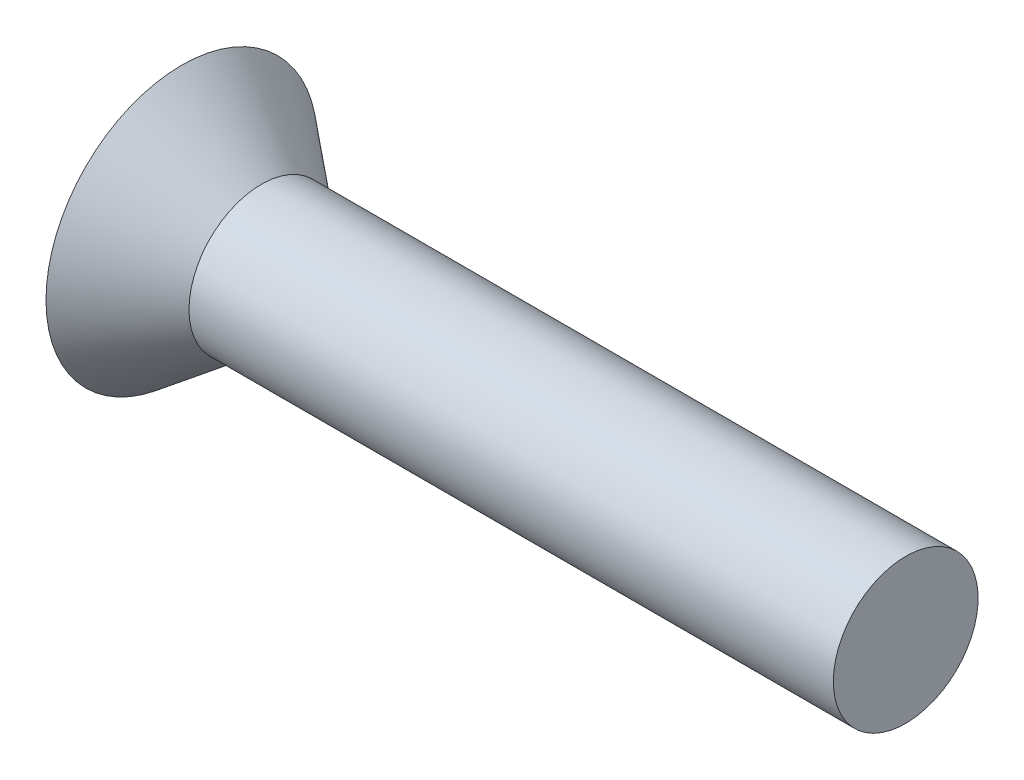
ISO-10303-21;
HEADER;
FILE_DESCRIPTION(('STEP AP214'),'2;1');
FILE_NAME('part.step','',(''),(''),'','','');
FILE_SCHEMA(('AUTOMOTIVE_DESIGN { 1 0 10303 214 1 1 1 1 }'));
ENDSEC;
DATA;
#1=APPLICATION_CONTEXT('core data for automotive mechanical design processes');
#2=APPLICATION_PROTOCOL_DEFINITION('international standard','automotive_design',2000,#1);
#3=PRODUCT_CONTEXT('',#1,'mechanical');
#4=PRODUCT('Part','Part','',(#3));
#5=PRODUCT_RELATED_PRODUCT_CATEGORY('part','',(#4));
#6=PRODUCT_DEFINITION_FORMATION('','',#4);
#7=PRODUCT_DEFINITION_CONTEXT('part definition',#1,'design');
#8=PRODUCT_DEFINITION('design','',#6,#7);
#9=PRODUCT_DEFINITION_SHAPE('','',#8);
#10=(LENGTH_UNIT() NAMED_UNIT(*) SI_UNIT(.MILLI.,.METRE.));
#11=(NAMED_UNIT(*) PLANE_ANGLE_UNIT() SI_UNIT($,.RADIAN.));
#12=(NAMED_UNIT(*) SI_UNIT($,.STERADIAN.) SOLID_ANGLE_UNIT());
#13=UNCERTAINTY_MEASURE_WITH_UNIT(LENGTH_MEASURE(1.E-05),#10,'distance_accuracy_value','');
#14=(GEOMETRIC_REPRESENTATION_CONTEXT(3) GLOBAL_UNCERTAINTY_ASSIGNED_CONTEXT((#13)) GLOBAL_UNIT_ASSIGNED_CONTEXT((#10,
#11,#12)) REPRESENTATION_CONTEXT('',''));
#15=CARTESIAN_POINT('',(0.,0.,0.));
#16=DIRECTION('',(0.,0.,1.));
#17=DIRECTION('',(1.,0.,0.));
#18=AXIS2_PLACEMENT_3D('',#15,#16,#17);
#19=CARTESIAN_POINT('',(0.,0.,0.));
#20=DIRECTION('',(1.,0.,0.));
#21=DIRECTION('',(0.,0.,-1.));
#22=AXIS2_PLACEMENT_3D('',#19,#20,#21);
#23=PLANE('',#22);
#24=CARTESIAN_POINT('',(0.,0.,0.));
#25=DIRECTION('',(-1.,0.,0.));
#26=DIRECTION('',(0.,0.,1.));
#27=AXIS2_PLACEMENT_3D('',#24,#25,#26);
#28=CIRCLE('',#27,3.75);
#29=CARTESIAN_POINT('',(0.,0.,3.75));
#30=VERTEX_POINT('',#29);
#31=EDGE_CURVE('E10',#30,#30,#28,.T.);
#32=ORIENTED_EDGE('',*,*,#31,.T.);
#33=EDGE_LOOP('',(#32));
#34=FACE_BOUND('',#33,.T.);
#35=ADVANCED_FACE('F32',(#34),#23,.F.);
#36=CARTESIAN_POINT('',(2.2,0.,0.));
#37=DIRECTION('',(-1.,0.,0.));
#38=DIRECTION('',(0.,0.,1.));
#39=AXIS2_PLACEMENT_3D('',#36,#37,#38);
#40=CONICAL_SURFACE('',#39,2.,0.671963171590232);
#41=ORIENTED_EDGE('',*,*,#31,.F.);
#42=EDGE_LOOP('',(#41));
#43=FACE_BOUND('',#42,.T.);
#44=CARTESIAN_POINT('',(2.2,0.,0.));
#45=DIRECTION('',(-1.,0.,0.));
#46=DIRECTION('',(0.,0.,1.));
#47=AXIS2_PLACEMENT_3D('',#44,#45,#46);
#48=CIRCLE('',#47,2.);
#49=CARTESIAN_POINT('',(2.2,0.,2.));
#50=VERTEX_POINT('',#49);
#51=EDGE_CURVE('E38',#50,#50,#48,.T.);
#52=ORIENTED_EDGE('',*,*,#51,.T.);
#53=EDGE_LOOP('',(#52));
#54=FACE_BOUND('',#53,.T.);
#55=ADVANCED_FACE('F57',(#43,#54),#40,.T.);
#56=CARTESIAN_POINT('',(0.,0.,0.));
#57=DIRECTION('',(-1.,0.,0.));
#58=DIRECTION('',(0.,0.,1.));
#59=AXIS2_PLACEMENT_3D('',#56,#57,#58);
#60=CYLINDRICAL_SURFACE('',#59,2.);
#61=ORIENTED_EDGE('',*,*,#51,.F.);
#62=EDGE_LOOP('',(#61));
#63=FACE_BOUND('',#62,.T.);
#64=CARTESIAN_POINT('',(20.,0.,0.));
#65=DIRECTION('',(-1.,0.,0.));
#66=DIRECTION('',(0.,0.,1.));
#67=AXIS2_PLACEMENT_3D('',#64,#65,#66);
#68=CIRCLE('',#67,2.);
#69=CARTESIAN_POINT('',(20.,0.,2.));
#70=VERTEX_POINT('',#69);
#71=EDGE_CURVE('E42',#70,#70,#68,.T.);
#72=ORIENTED_EDGE('',*,*,#71,.T.);
#73=EDGE_LOOP('',(#72));
#74=FACE_BOUND('',#73,.T.);
#75=ADVANCED_FACE('F49',(#63,#74),#60,.T.);
#76=CARTESIAN_POINT('',(20.,2.,0.));
#77=DIRECTION('',(-1.,0.,0.));
#78=DIRECTION('',(0.,0.,1.));
#79=AXIS2_PLACEMENT_3D('',#76,#77,#78);
#80=PLANE('',#79);
#81=ORIENTED_EDGE('',*,*,#71,.F.);
#82=EDGE_LOOP('',(#81));
#83=FACE_BOUND('',#82,.T.);
#84=ADVANCED_FACE('F51',(#83),#80,.F.);
#85=CLOSED_SHELL('',(#35,#55,#75,#84));
#86=MANIFOLD_SOLID_BREP('B2',#85);
#87=ADVANCED_BREP_SHAPE_REPRESENTATION('',(#18,#86),#14);
#88=SHAPE_DEFINITION_REPRESENTATION(#9,#87);
ENDSEC;
END-ISO-10303-21;
